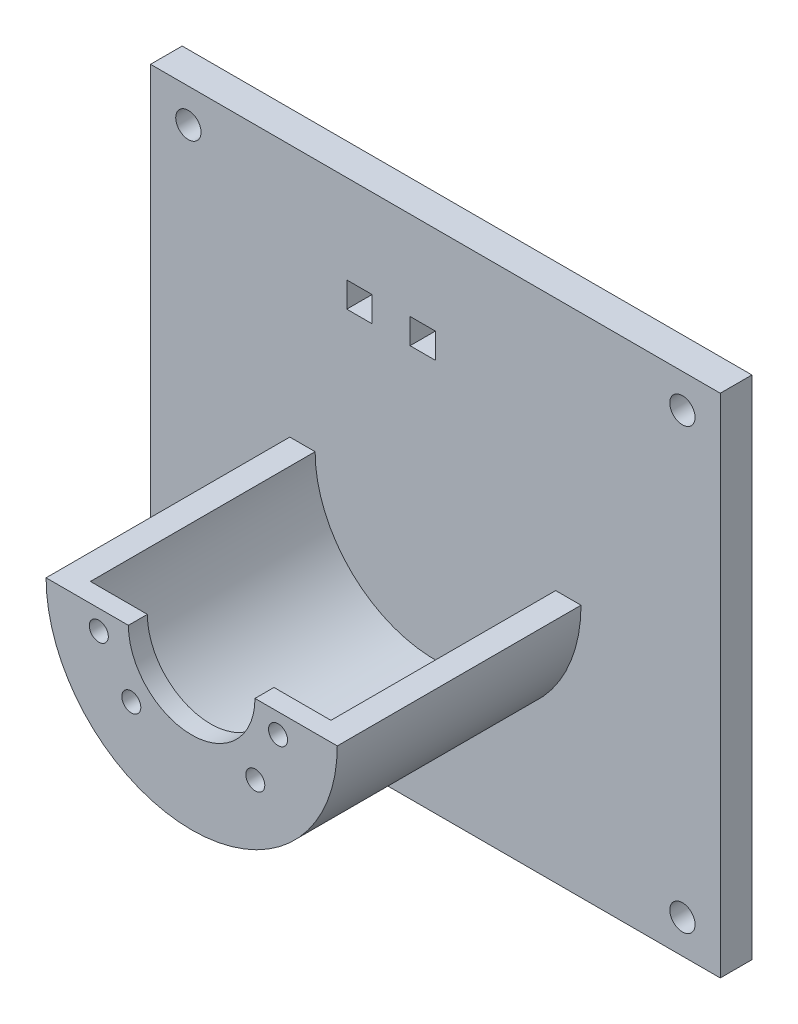
ISO-10303-21;
HEADER;
FILE_DESCRIPTION(('STEP AP214'),'2;1');
FILE_NAME('part.step','',(''),(''),'','','');
FILE_SCHEMA(('AUTOMOTIVE_DESIGN { 1 0 10303 214 1 1 1 1 }'));
ENDSEC;
DATA;
#1=APPLICATION_CONTEXT('core data for automotive mechanical design processes');
#2=APPLICATION_PROTOCOL_DEFINITION('international standard','automotive_design',2000,#1);
#3=PRODUCT_CONTEXT('',#1,'mechanical');
#4=PRODUCT('Part','Part','',(#3));
#5=PRODUCT_RELATED_PRODUCT_CATEGORY('part','',(#4));
#6=PRODUCT_DEFINITION_FORMATION('','',#4);
#7=PRODUCT_DEFINITION_CONTEXT('part definition',#1,'design');
#8=PRODUCT_DEFINITION('design','',#6,#7);
#9=PRODUCT_DEFINITION_SHAPE('','',#8);
#10=(LENGTH_UNIT() NAMED_UNIT(*) SI_UNIT(.MILLI.,.METRE.));
#11=(NAMED_UNIT(*) PLANE_ANGLE_UNIT() SI_UNIT($,.RADIAN.));
#12=(NAMED_UNIT(*) SI_UNIT($,.STERADIAN.) SOLID_ANGLE_UNIT());
#13=UNCERTAINTY_MEASURE_WITH_UNIT(LENGTH_MEASURE(1.E-05),#10,'distance_accuracy_value','');
#14=(GEOMETRIC_REPRESENTATION_CONTEXT(3) GLOBAL_UNCERTAINTY_ASSIGNED_CONTEXT((#13)) GLOBAL_UNIT_ASSIGNED_CONTEXT((#10,
#11,#12)) REPRESENTATION_CONTEXT('',''));
#15=CARTESIAN_POINT('',(0.,0.,0.));
#16=DIRECTION('',(0.,0.,1.));
#17=DIRECTION('',(1.,0.,0.));
#18=AXIS2_PLACEMENT_3D('',#15,#16,#17);
#19=CARTESIAN_POINT('',(-23.,0.,35.5));
#20=DIRECTION('',(0.,1.,0.));
#21=DIRECTION('',(0.,0.,1.));
#22=AXIS2_PLACEMENT_3D('',#19,#20,#21);
#23=PLANE('',#22);
#24=DIRECTION('',(1.,0.,0.));
#25=VECTOR('',#24,1.);
#26=CARTESIAN_POINT('',(-23.,0.,0.));
#27=LINE('',#26,#25);
#28=CARTESIAN_POINT('',(-23.,0.,0.));
#29=VERTEX_POINT('',#28);
#30=CARTESIAN_POINT('',(-19.,0.,0.));
#31=VERTEX_POINT('',#30);
#32=EDGE_CURVE('E404',#29,#31,#27,.T.);
#33=ORIENTED_EDGE('',*,*,#32,.F.);
#34=DIRECTION('',(0.,0.,-1.));
#35=VECTOR('',#34,1.);
#36=CARTESIAN_POINT('',(-23.,0.,35.5));
#37=LINE('',#36,#35);
#38=CARTESIAN_POINT('',(-23.,-1.60608141586784E-13,38.5));
#39=VERTEX_POINT('',#38);
#40=EDGE_CURVE('E11',#39,#29,#37,.T.);
#41=ORIENTED_EDGE('',*,*,#40,.F.);
#42=DIRECTION('',(-1.,0.,0.));
#43=VECTOR('',#42,1.);
#44=CARTESIAN_POINT('',(-23.,-1.60608141586784E-13,38.5));
#45=LINE('',#44,#43);
#46=CARTESIAN_POINT('',(-10.,0.,38.5));
#47=VERTEX_POINT('',#46);
#48=EDGE_CURVE('E299',#47,#39,#45,.T.);
#49=ORIENTED_EDGE('',*,*,#48,.F.);
#50=DIRECTION('',(0.,0.,-1.));
#51=VECTOR('',#50,1.);
#52=CARTESIAN_POINT('',(-10.,0.,38.5));
#53=LINE('',#52,#51);
#54=CARTESIAN_POINT('',(-10.,0.,35.5));
#55=VERTEX_POINT('',#54);
#56=EDGE_CURVE('E324',#47,#55,#53,.T.);
#57=ORIENTED_EDGE('',*,*,#56,.T.);
#58=DIRECTION('',(-1.,0.,0.));
#59=VECTOR('',#58,1.);
#60=CARTESIAN_POINT('',(-23.,-1.60608141586784E-13,35.5));
#61=LINE('',#60,#59);
#62=CARTESIAN_POINT('',(-19.,-1.11190251867774E-13,35.5));
#63=VERTEX_POINT('',#62);
#64=EDGE_CURVE('E315',#55,#63,#61,.T.);
#65=ORIENTED_EDGE('',*,*,#64,.T.);
#66=DIRECTION('',(0.,0.,-1.));
#67=VECTOR('',#66,1.);
#68=CARTESIAN_POINT('',(-19.,0.,35.5));
#69=LINE('',#68,#67);
#70=EDGE_CURVE('E45',#63,#31,#69,.T.);
#71=ORIENTED_EDGE('',*,*,#70,.T.);
#72=EDGE_LOOP('',(#33,#41,#49,#57,#65,#71));
#73=FACE_BOUND('',#72,.T.);
#74=ADVANCED_FACE('F42',(#73),#23,.T.);
#75=CARTESIAN_POINT('',(0.,0.,35.5));
#76=DIRECTION('',(0.,0.,-1.));
#77=DIRECTION('',(-1.,0.,0.));
#78=AXIS2_PLACEMENT_3D('',#75,#76,#77);
#79=CYLINDRICAL_SURFACE('',#78,23.);
#80=CARTESIAN_POINT('',(0.,0.,0.));
#81=DIRECTION('',(0.,0.,1.));
#82=DIRECTION('',(1.,0.,0.));
#83=AXIS2_PLACEMENT_3D('',#80,#81,#82);
#84=CIRCLE('',#83,23.);
#85=CARTESIAN_POINT('',(23.,0.,0.));
#86=VERTEX_POINT('',#85);
#87=EDGE_CURVE('E409',#29,#86,#84,.T.);
#88=ORIENTED_EDGE('',*,*,#87,.T.);
#89=DIRECTION('',(0.,0.,-1.));
#90=VECTOR('',#89,1.);
#91=CARTESIAN_POINT('',(23.,0.,35.5));
#92=LINE('',#91,#90);
#93=CARTESIAN_POINT('',(23.,0.,38.5));
#94=VERTEX_POINT('',#93);
#95=EDGE_CURVE('E51',#94,#86,#92,.T.);
#96=ORIENTED_EDGE('',*,*,#95,.F.);
#97=CARTESIAN_POINT('',(0.,0.,38.5));
#98=DIRECTION('',(0.,0.,1.));
#99=DIRECTION('',(1.,0.,0.));
#100=AXIS2_PLACEMENT_3D('',#97,#98,#99);
#101=CIRCLE('',#100,23.);
#102=EDGE_CURVE('E304',#39,#94,#101,.T.);
#103=ORIENTED_EDGE('',*,*,#102,.F.);
#104=ORIENTED_EDGE('',*,*,#40,.T.);
#105=EDGE_LOOP('',(#88,#96,#103,#104));
#106=FACE_BOUND('',#105,.T.);
#107=ADVANCED_FACE('F440',(#106),#79,.T.);
#108=CARTESIAN_POINT('',(19.,0.,35.5));
#109=DIRECTION('',(0.,1.,0.));
#110=DIRECTION('',(0.,0.,1.));
#111=AXIS2_PLACEMENT_3D('',#108,#109,#110);
#112=PLANE('',#111);
#113=DIRECTION('',(1.,0.,0.));
#114=VECTOR('',#113,1.);
#115=CARTESIAN_POINT('',(19.,0.,0.));
#116=LINE('',#115,#114);
#117=CARTESIAN_POINT('',(19.,0.,0.));
#118=VERTEX_POINT('',#117);
#119=EDGE_CURVE('E415',#118,#86,#116,.T.);
#120=ORIENTED_EDGE('',*,*,#119,.F.);
#121=DIRECTION('',(0.,0.,-1.));
#122=VECTOR('',#121,1.);
#123=CARTESIAN_POINT('',(19.,0.,35.5));
#124=LINE('',#123,#122);
#125=CARTESIAN_POINT('',(19.,0.,35.5));
#126=VERTEX_POINT('',#125);
#127=EDGE_CURVE('E423',#126,#118,#124,.T.);
#128=ORIENTED_EDGE('',*,*,#127,.F.);
#129=DIRECTION('',(-1.,0.,0.));
#130=VECTOR('',#129,1.);
#131=CARTESIAN_POINT('',(10.,0.,35.5));
#132=LINE('',#131,#130);
#133=CARTESIAN_POINT('',(10.,0.,35.5));
#134=VERTEX_POINT('',#133);
#135=EDGE_CURVE('E300',#126,#134,#132,.T.);
#136=ORIENTED_EDGE('',*,*,#135,.T.);
#137=DIRECTION('',(0.,0.,-1.));
#138=VECTOR('',#137,1.);
#139=CARTESIAN_POINT('',(10.,0.,38.5));
#140=LINE('',#139,#138);
#141=CARTESIAN_POINT('',(10.,0.,38.5));
#142=VERTEX_POINT('',#141);
#143=EDGE_CURVE('E311',#142,#134,#140,.T.);
#144=ORIENTED_EDGE('',*,*,#143,.F.);
#145=DIRECTION('',(-1.,0.,0.));
#146=VECTOR('',#145,1.);
#147=CARTESIAN_POINT('',(10.,0.,38.5));
#148=LINE('',#147,#146);
#149=EDGE_CURVE('E308',#94,#142,#148,.T.);
#150=ORIENTED_EDGE('',*,*,#149,.F.);
#151=ORIENTED_EDGE('',*,*,#95,.T.);
#152=EDGE_LOOP('',(#120,#128,#136,#144,#150,#151));
#153=FACE_BOUND('',#152,.T.);
#154=ADVANCED_FACE('F453',(#153),#112,.T.);
#155=CARTESIAN_POINT('',(0.,0.,35.5));
#156=DIRECTION('',(0.,0.,-1.));
#157=DIRECTION('',(-1.,0.,0.));
#158=AXIS2_PLACEMENT_3D('',#155,#156,#157);
#159=CYLINDRICAL_SURFACE('',#158,19.);
#160=CARTESIAN_POINT('',(0.,0.,0.));
#161=DIRECTION('',(0.,0.,1.));
#162=DIRECTION('',(1.,0.,0.));
#163=AXIS2_PLACEMENT_3D('',#160,#161,#162);
#164=CIRCLE('',#163,19.);
#165=EDGE_CURVE('E412',#31,#118,#164,.T.);
#166=ORIENTED_EDGE('',*,*,#165,.F.);
#167=ORIENTED_EDGE('',*,*,#70,.F.);
#168=CARTESIAN_POINT('',(0.,0.,35.5));
#169=DIRECTION('',(0.,0.,1.));
#170=DIRECTION('',(1.,0.,0.));
#171=AXIS2_PLACEMENT_3D('',#168,#169,#170);
#172=CIRCLE('',#171,19.);
#173=EDGE_CURVE('E405',#63,#126,#172,.T.);
#174=ORIENTED_EDGE('',*,*,#173,.T.);
#175=ORIENTED_EDGE('',*,*,#127,.T.);
#176=EDGE_LOOP('',(#166,#167,#174,#175));
#177=FACE_BOUND('',#176,.T.);
#178=ADVANCED_FACE('F435',(#177),#159,.F.);
#179=CARTESIAN_POINT('',(0.,0.,0.));
#180=DIRECTION('',(0.,0.,-1.));
#181=DIRECTION('',(-1.,0.,0.));
#182=AXIS2_PLACEMENT_3D('',#179,#180,#181);
#183=PLANE('',#182);
#184=DIRECTION('',(1.,0.,0.));
#185=VECTOR('',#184,1.);
#186=CARTESIAN_POINT('',(-14.,22.,0.));
#187=LINE('',#186,#185);
#188=CARTESIAN_POINT('',(-14.,22.,0.));
#189=VERTEX_POINT('',#188);
#190=CARTESIAN_POINT('',(-10.,22.,0.));
#191=VERTEX_POINT('',#190);
#192=EDGE_CURVE('E206',#189,#191,#187,.T.);
#193=ORIENTED_EDGE('',*,*,#192,.F.);
#194=DIRECTION('',(0.,-1.,0.));
#195=VECTOR('',#194,1.);
#196=CARTESIAN_POINT('',(-14.,26.,0.));
#197=LINE('',#196,#195);
#198=CARTESIAN_POINT('',(-14.,26.,0.));
#199=VERTEX_POINT('',#198);
#200=EDGE_CURVE('E59',#199,#189,#197,.T.);
#201=ORIENTED_EDGE('',*,*,#200,.F.);
#202=DIRECTION('',(-1.,0.,0.));
#203=VECTOR('',#202,1.);
#204=CARTESIAN_POINT('',(-14.,26.,0.));
#205=LINE('',#204,#203);
#206=CARTESIAN_POINT('',(-10.,26.,0.));
#207=VERTEX_POINT('',#206);
#208=EDGE_CURVE('E193',#207,#199,#205,.T.);
#209=ORIENTED_EDGE('',*,*,#208,.F.);
#210=DIRECTION('',(0.,1.,0.));
#211=VECTOR('',#210,1.);
#212=CARTESIAN_POINT('',(-10.,26.,0.));
#213=LINE('',#212,#211);
#214=EDGE_CURVE('E197',#191,#207,#213,.T.);
#215=ORIENTED_EDGE('',*,*,#214,.F.);
#216=EDGE_LOOP('',(#193,#201,#209,#215));
#217=FACE_BOUND('',#216,.T.);
#218=DIRECTION('',(0.,-1.,0.));
#219=VECTOR('',#218,1.);
#220=CARTESIAN_POINT('',(-4.,26.0000000000001,0.));
#221=LINE('',#220,#219);
#222=CARTESIAN_POINT('',(-4.,26.0000000000001,0.));
#223=VERTEX_POINT('',#222);
#224=CARTESIAN_POINT('',(-4.,22.0000000000001,0.));
#225=VERTEX_POINT('',#224);
#226=EDGE_CURVE('E242',#223,#225,#221,.T.);
#227=ORIENTED_EDGE('',*,*,#226,.F.);
#228=DIRECTION('',(-1.,0.,0.));
#229=VECTOR('',#228,1.);
#230=CARTESIAN_POINT('',(-4.,26.0000000000001,0.));
#231=LINE('',#230,#229);
#232=CARTESIAN_POINT('',(0.,26.0000000000001,0.));
#233=VERTEX_POINT('',#232);
#234=EDGE_CURVE('E67',#233,#223,#231,.T.);
#235=ORIENTED_EDGE('',*,*,#234,.F.);
#236=DIRECTION('',(0.,1.,0.));
#237=VECTOR('',#236,1.);
#238=CARTESIAN_POINT('',(0.,26.0000000000001,0.));
#239=LINE('',#238,#237);
#240=CARTESIAN_POINT('',(0.,22.0000000000001,0.));
#241=VERTEX_POINT('',#240);
#242=EDGE_CURVE('E227',#241,#233,#239,.T.);
#243=ORIENTED_EDGE('',*,*,#242,.F.);
#244=DIRECTION('',(1.,0.,0.));
#245=VECTOR('',#244,1.);
#246=CARTESIAN_POINT('',(-4.,22.0000000000001,0.));
#247=LINE('',#246,#245);
#248=EDGE_CURVE('E246',#225,#241,#247,.T.);
#249=ORIENTED_EDGE('',*,*,#248,.F.);
#250=EDGE_LOOP('',(#227,#235,#243,#249));
#251=FACE_BOUND('',#250,.T.);
#252=CARTESIAN_POINT('',(-39.0207254505307,34.6850892893606,0.));
#253=DIRECTION('',(0.,0.,-1.));
#254=DIRECTION('',(-1.,0.,0.));
#255=AXIS2_PLACEMENT_3D('',#252,#253,#254);
#256=CIRCLE('',#255,2.);
#257=CARTESIAN_POINT('',(-41.0207254505307,34.6850892893606,0.));
#258=VERTEX_POINT('',#257);
#259=EDGE_CURVE('E328',#258,#258,#256,.F.);
#260=ORIENTED_EDGE('',*,*,#259,.F.);
#261=EDGE_LOOP('',(#260));
#262=FACE_BOUND('',#261,.T.);
#263=CARTESIAN_POINT('',(39.0207254505307,34.6850892893606,0.));
#264=DIRECTION('',(0.,0.,-1.));
#265=DIRECTION('',(-1.,0.,0.));
#266=AXIS2_PLACEMENT_3D('',#263,#264,#265);
#267=CIRCLE('',#266,2.);
#268=CARTESIAN_POINT('',(37.0207254505307,34.6850892893606,0.));
#269=VERTEX_POINT('',#268);
#270=EDGE_CURVE('E365',#269,#269,#267,.T.);
#271=ORIENTED_EDGE('',*,*,#270,.T.);
#272=EDGE_LOOP('',(#271));
#273=FACE_BOUND('',#272,.T.);
#274=DIRECTION('',(0.,-1.,0.));
#275=VECTOR('',#274,1.);
#276=CARTESIAN_POINT('',(-45.,0.,0.));
#277=LINE('',#276,#275);
#278=CARTESIAN_POINT('',(-45.,40.,0.));
#279=VERTEX_POINT('',#278);
#280=CARTESIAN_POINT('',(-45.,-40.,0.));
#281=VERTEX_POINT('',#280);
#282=EDGE_CURVE('E369',#279,#281,#277,.T.);
#283=ORIENTED_EDGE('',*,*,#282,.T.);
#284=DIRECTION('',(-1.,0.,0.));
#285=VECTOR('',#284,1.);
#286=CARTESIAN_POINT('',(0.,-40.,0.));
#287=LINE('',#286,#285);
#288=CARTESIAN_POINT('',(45.,-40.,0.));
#289=VERTEX_POINT('',#288);
#290=EDGE_CURVE('E381',#289,#281,#287,.T.);
#291=ORIENTED_EDGE('',*,*,#290,.F.);
#292=DIRECTION('',(0.,-1.,0.));
#293=VECTOR('',#292,1.);
#294=CARTESIAN_POINT('',(45.,0.,0.));
#295=LINE('',#294,#293);
#296=CARTESIAN_POINT('',(45.,40.,0.));
#297=VERTEX_POINT('',#296);
#298=EDGE_CURVE('E377',#297,#289,#295,.T.);
#299=ORIENTED_EDGE('',*,*,#298,.F.);
#300=DIRECTION('',(-1.,0.,0.));
#301=VECTOR('',#300,1.);
#302=CARTESIAN_POINT('',(0.,40.,0.));
#303=LINE('',#302,#301);
#304=EDGE_CURVE('E373',#297,#279,#303,.T.);
#305=ORIENTED_EDGE('',*,*,#304,.T.);
#306=EDGE_LOOP('',(#283,#291,#299,#305));
#307=FACE_BOUND('',#306,.T.);
#308=CARTESIAN_POINT('',(-39.0207254505307,-34.6850892893606,0.));
#309=DIRECTION('',(0.,0.,-1.));
#310=DIRECTION('',(-1.,0.,0.));
#311=AXIS2_PLACEMENT_3D('',#308,#309,#310);
#312=CIRCLE('',#311,2.);
#313=CARTESIAN_POINT('',(-41.0207254505307,-34.6850892893606,0.));
#314=VERTEX_POINT('',#313);
#315=EDGE_CURVE('E385',#314,#314,#312,.T.);
#316=ORIENTED_EDGE('',*,*,#315,.T.);
#317=EDGE_LOOP('',(#316));
#318=FACE_BOUND('',#317,.T.);
#319=CARTESIAN_POINT('',(39.0207254505307,-34.6850892893606,0.));
#320=DIRECTION('',(0.,0.,-1.));
#321=DIRECTION('',(-1.,0.,0.));
#322=AXIS2_PLACEMENT_3D('',#319,#320,#321);
#323=CIRCLE('',#322,2.);
#324=CARTESIAN_POINT('',(37.0207254505307,-34.6850892893606,0.));
#325=VERTEX_POINT('',#324);
#326=EDGE_CURVE('E334',#325,#325,#323,.F.);
#327=ORIENTED_EDGE('',*,*,#326,.F.);
#328=EDGE_LOOP('',(#327));
#329=FACE_BOUND('',#328,.T.);
#330=ORIENTED_EDGE('',*,*,#87,.F.);
#331=ORIENTED_EDGE('',*,*,#32,.T.);
#332=ORIENTED_EDGE('',*,*,#165,.T.);
#333=ORIENTED_EDGE('',*,*,#119,.T.);
#334=EDGE_LOOP('',(#330,#331,#332,#333));
#335=FACE_BOUND('',#334,.T.);
#336=ADVANCED_FACE('F437',(#217,#251,#262,#273,#307,#318,#329,#335),#183,.F.);
#337=CARTESIAN_POINT('',(-45.,0.,-5.));
#338=DIRECTION('',(-1.,0.,0.));
#339=DIRECTION('',(0.,-1.,0.));
#340=AXIS2_PLACEMENT_3D('',#337,#338,#339);
#341=PLANE('',#340);
#342=ORIENTED_EDGE('',*,*,#282,.F.);
#343=DIRECTION('',(0.,0.,1.));
#344=VECTOR('',#343,1.);
#345=CARTESIAN_POINT('',(-45.,40.,-5.));
#346=LINE('',#345,#344);
#347=CARTESIAN_POINT('',(-45.,40.,-5.));
#348=VERTEX_POINT('',#347);
#349=EDGE_CURVE('E401',#348,#279,#346,.T.);
#350=ORIENTED_EDGE('',*,*,#349,.F.);
#351=DIRECTION('',(0.,-1.,0.));
#352=VECTOR('',#351,1.);
#353=CARTESIAN_POINT('',(-45.,0.,-5.));
#354=LINE('',#353,#352);
#355=CARTESIAN_POINT('',(-45.,-40.,-5.));
#356=VERTEX_POINT('',#355);
#357=EDGE_CURVE('E338',#348,#356,#354,.T.);
#358=ORIENTED_EDGE('',*,*,#357,.T.);
#359=DIRECTION('',(0.,0.,1.));
#360=VECTOR('',#359,1.);
#361=CARTESIAN_POINT('',(-45.,-40.,-5.));
#362=LINE('',#361,#360);
#363=EDGE_CURVE('E361',#356,#281,#362,.T.);
#364=ORIENTED_EDGE('',*,*,#363,.T.);
#365=EDGE_LOOP('',(#342,#350,#358,#364));
#366=FACE_BOUND('',#365,.T.);
#367=ADVANCED_FACE('F560',(#366),#341,.T.);
#368=CARTESIAN_POINT('',(0.,40.,-5.));
#369=DIRECTION('',(0.,1.,0.));
#370=DIRECTION('',(0.,0.,1.));
#371=AXIS2_PLACEMENT_3D('',#368,#369,#370);
#372=PLANE('',#371);
#373=ORIENTED_EDGE('',*,*,#304,.F.);
#374=DIRECTION('',(0.,0.,1.));
#375=VECTOR('',#374,1.);
#376=CARTESIAN_POINT('',(45.,40.,-5.));
#377=LINE('',#376,#375);
#378=CARTESIAN_POINT('',(45.,40.,-5.));
#379=VERTEX_POINT('',#378);
#380=EDGE_CURVE('E398',#379,#297,#377,.T.);
#381=ORIENTED_EDGE('',*,*,#380,.F.);
#382=DIRECTION('',(-1.,0.,0.));
#383=VECTOR('',#382,1.);
#384=CARTESIAN_POINT('',(0.,40.,-5.));
#385=LINE('',#384,#383);
#386=EDGE_CURVE('E342',#379,#348,#385,.T.);
#387=ORIENTED_EDGE('',*,*,#386,.T.);
#388=ORIENTED_EDGE('',*,*,#349,.T.);
#389=EDGE_LOOP('',(#373,#381,#387,#388));
#390=FACE_BOUND('',#389,.T.);
#391=ADVANCED_FACE('F659',(#390),#372,.T.);
#392=CARTESIAN_POINT('',(45.,0.,-5.));
#393=DIRECTION('',(-1.,0.,0.));
#394=DIRECTION('',(0.,-1.,0.));
#395=AXIS2_PLACEMENT_3D('',#392,#393,#394);
#396=PLANE('',#395);
#397=ORIENTED_EDGE('',*,*,#298,.T.);
#398=DIRECTION('',(0.,0.,1.));
#399=VECTOR('',#398,1.);
#400=CARTESIAN_POINT('',(45.,-40.,-5.));
#401=LINE('',#400,#399);
#402=CARTESIAN_POINT('',(45.,-40.,-5.));
#403=VERTEX_POINT('',#402);
#404=EDGE_CURVE('E394',#403,#289,#401,.T.);
#405=ORIENTED_EDGE('',*,*,#404,.F.);
#406=DIRECTION('',(0.,-1.,0.));
#407=VECTOR('',#406,1.);
#408=CARTESIAN_POINT('',(45.,0.,-5.));
#409=LINE('',#408,#407);
#410=EDGE_CURVE('E346',#379,#403,#409,.T.);
#411=ORIENTED_EDGE('',*,*,#410,.F.);
#412=ORIENTED_EDGE('',*,*,#380,.T.);
#413=EDGE_LOOP('',(#397,#405,#411,#412));
#414=FACE_BOUND('',#413,.T.);
#415=ADVANCED_FACE('F651',(#414),#396,.F.);
#416=CARTESIAN_POINT('',(-39.0207254505307,-34.6850892893606,-5.));
#417=DIRECTION('',(0.,0.,1.));
#418=DIRECTION('',(1.,0.,0.));
#419=AXIS2_PLACEMENT_3D('',#416,#417,#418);
#420=CYLINDRICAL_SURFACE('',#419,2.);
#421=CARTESIAN_POINT('',(-39.0207254505307,-34.6850892893606,-5.));
#422=DIRECTION('',(0.,0.,-1.));
#423=DIRECTION('',(-1.,0.,0.));
#424=AXIS2_PLACEMENT_3D('',#421,#422,#423);
#425=CIRCLE('',#424,2.);
#426=CARTESIAN_POINT('',(-41.0207254505307,-34.6850892893606,-5.));
#427=VERTEX_POINT('',#426);
#428=EDGE_CURVE('E353',#427,#427,#425,.T.);
#429=ORIENTED_EDGE('',*,*,#428,.T.);
#430=EDGE_LOOP('',(#429));
#431=FACE_BOUND('',#430,.T.);
#432=ORIENTED_EDGE('',*,*,#315,.F.);
#433=EDGE_LOOP('',(#432));
#434=FACE_BOUND('',#433,.T.);
#435=ADVANCED_FACE('F647',(#431,#434),#420,.F.);
#436=CARTESIAN_POINT('',(0.,-40.,-5.));
#437=DIRECTION('',(0.,1.,0.));
#438=DIRECTION('',(0.,0.,1.));
#439=AXIS2_PLACEMENT_3D('',#436,#437,#438);
#440=PLANE('',#439);
#441=ORIENTED_EDGE('',*,*,#290,.T.);
#442=ORIENTED_EDGE('',*,*,#363,.F.);
#443=DIRECTION('',(-1.,0.,0.));
#444=VECTOR('',#443,1.);
#445=CARTESIAN_POINT('',(0.,-40.,-5.));
#446=LINE('',#445,#444);
#447=EDGE_CURVE('E350',#403,#356,#446,.T.);
#448=ORIENTED_EDGE('',*,*,#447,.F.);
#449=ORIENTED_EDGE('',*,*,#404,.T.);
#450=EDGE_LOOP('',(#441,#442,#448,#449));
#451=FACE_BOUND('',#450,.T.);
#452=ADVANCED_FACE('F650',(#451),#440,.F.);
#453=CARTESIAN_POINT('',(39.0207254505307,34.6850892893606,-5.));
#454=DIRECTION('',(0.,0.,1.));
#455=DIRECTION('',(1.,0.,0.));
#456=AXIS2_PLACEMENT_3D('',#453,#454,#455);
#457=CYLINDRICAL_SURFACE('',#456,2.);
#458=CARTESIAN_POINT('',(39.0207254505307,34.6850892893606,-5.));
#459=DIRECTION('',(0.,0.,-1.));
#460=DIRECTION('',(-1.,0.,0.));
#461=AXIS2_PLACEMENT_3D('',#458,#459,#460);
#462=CIRCLE('',#461,2.);
#463=CARTESIAN_POINT('',(37.0207254505307,34.6850892893606,-5.));
#464=VERTEX_POINT('',#463);
#465=EDGE_CURVE('E333',#464,#464,#462,.T.);
#466=ORIENTED_EDGE('',*,*,#465,.T.);
#467=EDGE_LOOP('',(#466));
#468=FACE_BOUND('',#467,.T.);
#469=ORIENTED_EDGE('',*,*,#270,.F.);
#470=EDGE_LOOP('',(#469));
#471=FACE_BOUND('',#470,.T.);
#472=ADVANCED_FACE('F655',(#468,#471),#457,.F.);
#473=CARTESIAN_POINT('',(-39.0207254505307,34.6850892893606,-5.));
#474=DIRECTION('',(0.,0.,1.));
#475=DIRECTION('',(1.,0.,0.));
#476=AXIS2_PLACEMENT_3D('',#473,#474,#475);
#477=CYLINDRICAL_SURFACE('',#476,2.);
#478=CARTESIAN_POINT('',(-39.0207254505307,34.6850892893606,-5.));
#479=DIRECTION('',(0.,0.,-1.));
#480=DIRECTION('',(-1.,0.,0.));
#481=AXIS2_PLACEMENT_3D('',#478,#479,#480);
#482=CIRCLE('',#481,2.);
#483=CARTESIAN_POINT('',(-41.0207254505307,34.6850892893606,-5.));
#484=VERTEX_POINT('',#483);
#485=EDGE_CURVE('E329',#484,#484,#482,.F.);
#486=ORIENTED_EDGE('',*,*,#485,.F.);
#487=EDGE_LOOP('',(#486));
#488=FACE_BOUND('',#487,.T.);
#489=ORIENTED_EDGE('',*,*,#259,.T.);
#490=EDGE_LOOP('',(#489));
#491=FACE_BOUND('',#490,.T.);
#492=ADVANCED_FACE('F645',(#488,#491),#477,.F.);
#493=CARTESIAN_POINT('',(39.0207254505307,-34.6850892893606,-5.));
#494=DIRECTION('',(0.,0.,1.));
#495=DIRECTION('',(1.,0.,0.));
#496=AXIS2_PLACEMENT_3D('',#493,#494,#495);
#497=CYLINDRICAL_SURFACE('',#496,2.);
#498=CARTESIAN_POINT('',(39.0207254505307,-34.6850892893606,-5.));
#499=DIRECTION('',(0.,0.,-1.));
#500=DIRECTION('',(-1.,0.,0.));
#501=AXIS2_PLACEMENT_3D('',#498,#499,#500);
#502=CIRCLE('',#501,2.);
#503=CARTESIAN_POINT('',(37.0207254505307,-34.6850892893606,-5.));
#504=VERTEX_POINT('',#503);
#505=EDGE_CURVE('E357',#504,#504,#502,.F.);
#506=ORIENTED_EDGE('',*,*,#505,.F.);
#507=EDGE_LOOP('',(#506));
#508=FACE_BOUND('',#507,.T.);
#509=ORIENTED_EDGE('',*,*,#326,.T.);
#510=EDGE_LOOP('',(#509));
#511=FACE_BOUND('',#510,.T.);
#512=ADVANCED_FACE('F567',(#508,#511),#497,.F.);
#513=CARTESIAN_POINT('',(0.,0.,-5.));
#514=DIRECTION('',(0.,0.,-1.));
#515=DIRECTION('',(-1.,0.,0.));
#516=AXIS2_PLACEMENT_3D('',#513,#514,#515);
#517=PLANE('',#516);
#518=DIRECTION('',(0.,-1.,0.));
#519=VECTOR('',#518,1.);
#520=CARTESIAN_POINT('',(-14.,26.,-5.));
#521=LINE('',#520,#519);
#522=CARTESIAN_POINT('',(-14.,26.,-5.));
#523=VERTEX_POINT('',#522);
#524=CARTESIAN_POINT('',(-14.,22.,-5.));
#525=VERTEX_POINT('',#524);
#526=EDGE_CURVE('E171',#523,#525,#521,.T.);
#527=ORIENTED_EDGE('',*,*,#526,.T.);
#528=DIRECTION('',(1.,0.,0.));
#529=VECTOR('',#528,1.);
#530=CARTESIAN_POINT('',(-14.,22.,-5.));
#531=LINE('',#530,#529);
#532=CARTESIAN_POINT('',(-10.,22.,-5.));
#533=VERTEX_POINT('',#532);
#534=EDGE_CURVE('E182',#525,#533,#531,.T.);
#535=ORIENTED_EDGE('',*,*,#534,.T.);
#536=DIRECTION('',(0.,1.,0.));
#537=VECTOR('',#536,1.);
#538=CARTESIAN_POINT('',(-10.,26.,-5.));
#539=LINE('',#538,#537);
#540=CARTESIAN_POINT('',(-10.,26.,-5.));
#541=VERTEX_POINT('',#540);
#542=EDGE_CURVE('E187',#533,#541,#539,.T.);
#543=ORIENTED_EDGE('',*,*,#542,.T.);
#544=DIRECTION('',(-1.,0.,0.));
#545=VECTOR('',#544,1.);
#546=CARTESIAN_POINT('',(-14.,26.,-5.));
#547=LINE('',#546,#545);
#548=EDGE_CURVE('E178',#541,#523,#547,.T.);
#549=ORIENTED_EDGE('',*,*,#548,.T.);
#550=EDGE_LOOP('',(#527,#535,#543,#549));
#551=FACE_BOUND('',#550,.T.);
#552=DIRECTION('',(-1.,0.,0.));
#553=VECTOR('',#552,1.);
#554=CARTESIAN_POINT('',(-4.,26.0000000000001,-5.));
#555=LINE('',#554,#553);
#556=CARTESIAN_POINT('',(0.,26.0000000000001,-5.));
#557=VERTEX_POINT('',#556);
#558=CARTESIAN_POINT('',(-4.,26.0000000000001,-5.));
#559=VERTEX_POINT('',#558);
#560=EDGE_CURVE('E222',#557,#559,#555,.T.);
#561=ORIENTED_EDGE('',*,*,#560,.T.);
#562=DIRECTION('',(0.,-1.,0.));
#563=VECTOR('',#562,1.);
#564=CARTESIAN_POINT('',(-4.,26.0000000000001,-5.));
#565=LINE('',#564,#563);
#566=CARTESIAN_POINT('',(-4.,22.0000000000001,-5.));
#567=VERTEX_POINT('',#566);
#568=EDGE_CURVE('E226',#559,#567,#565,.T.);
#569=ORIENTED_EDGE('',*,*,#568,.T.);
#570=DIRECTION('',(1.,0.,0.));
#571=VECTOR('',#570,1.);
#572=CARTESIAN_POINT('',(-4.,22.0000000000001,-5.));
#573=LINE('',#572,#571);
#574=CARTESIAN_POINT('',(0.,22.0000000000001,-5.));
#575=VERTEX_POINT('',#574);
#576=EDGE_CURVE('E231',#567,#575,#573,.T.);
#577=ORIENTED_EDGE('',*,*,#576,.T.);
#578=DIRECTION('',(0.,1.,0.));
#579=VECTOR('',#578,1.);
#580=CARTESIAN_POINT('',(0.,26.0000000000001,-5.));
#581=LINE('',#580,#579);
#582=EDGE_CURVE('E235',#575,#557,#581,.T.);
#583=ORIENTED_EDGE('',*,*,#582,.T.);
#584=EDGE_LOOP('',(#561,#569,#577,#583));
#585=FACE_BOUND('',#584,.T.);
#586=ORIENTED_EDGE('',*,*,#485,.T.);
#587=EDGE_LOOP('',(#586));
#588=FACE_BOUND('',#587,.T.);
#589=ORIENTED_EDGE('',*,*,#465,.F.);
#590=EDGE_LOOP('',(#589));
#591=FACE_BOUND('',#590,.T.);
#592=ORIENTED_EDGE('',*,*,#357,.F.);
#593=ORIENTED_EDGE('',*,*,#386,.F.);
#594=ORIENTED_EDGE('',*,*,#410,.T.);
#595=ORIENTED_EDGE('',*,*,#447,.T.);
#596=EDGE_LOOP('',(#592,#593,#594,#595));
#597=FACE_BOUND('',#596,.T.);
#598=ORIENTED_EDGE('',*,*,#428,.F.);
#599=EDGE_LOOP('',(#598));
#600=FACE_BOUND('',#599,.T.);
#601=ORIENTED_EDGE('',*,*,#505,.T.);
#602=EDGE_LOOP('',(#601));
#603=FACE_BOUND('',#602,.T.);
#604=ADVANCED_FACE('F189',(#551,#585,#588,#591,#597,#600,#603),#517,.T.);
#605=CARTESIAN_POINT('',(0.,0.,35.5));
#606=DIRECTION('',(0.,0.,1.));
#607=DIRECTION('',(1.,0.,0.));
#608=AXIS2_PLACEMENT_3D('',#605,#606,#607);
#609=PLANE('',#608);
#610=CARTESIAN_POINT('',(-14.668830541062,-3.13455109347509,35.5));
#611=DIRECTION('',(0.,0.,1.));
#612=DIRECTION('',(1.,0.,0.));
#613=AXIS2_PLACEMENT_3D('',#610,#611,#612);
#614=CIRCLE('',#613,1.5);
#615=CARTESIAN_POINT('',(-13.168830541062,-3.13455109347509,35.5));
#616=VERTEX_POINT('',#615);
#617=EDGE_CURVE('E277',#616,#616,#614,.F.);
#618=ORIENTED_EDGE('',*,*,#617,.F.);
#619=EDGE_LOOP('',(#618));
#620=FACE_BOUND('',#619,.T.);
#621=CARTESIAN_POINT('',(13.6445809551776,-3.13455109347509,35.5));
#622=DIRECTION('',(0.,0.,1.));
#623=DIRECTION('',(1.,0.,0.));
#624=AXIS2_PLACEMENT_3D('',#621,#622,#623);
#625=CIRCLE('',#624,1.5);
#626=CARTESIAN_POINT('',(15.1445809551776,-3.13455109347509,35.5));
#627=VERTEX_POINT('',#626);
#628=EDGE_CURVE('E268',#627,#627,#625,.F.);
#629=ORIENTED_EDGE('',*,*,#628,.F.);
#630=EDGE_LOOP('',(#629));
#631=FACE_BOUND('',#630,.T.);
#632=CARTESIAN_POINT('',(10.0490161469407,-11.1363043456312,35.5));
#633=DIRECTION('',(0.,0.,1.));
#634=DIRECTION('',(1.,0.,0.));
#635=AXIS2_PLACEMENT_3D('',#632,#633,#634);
#636=CIRCLE('',#635,1.5);
#637=CARTESIAN_POINT('',(11.5490161469407,-11.1363043456312,35.5));
#638=VERTEX_POINT('',#637);
#639=EDGE_CURVE('E267',#638,#638,#636,.F.);
#640=ORIENTED_EDGE('',*,*,#639,.F.);
#641=EDGE_LOOP('',(#640));
#642=FACE_BOUND('',#641,.T.);
#643=CARTESIAN_POINT('',(-9.5368913539985,-10.2492781844396,35.5));
#644=DIRECTION('',(0.,0.,1.));
#645=DIRECTION('',(1.,0.,0.));
#646=AXIS2_PLACEMENT_3D('',#643,#644,#645);
#647=CIRCLE('',#646,1.5);
#648=CARTESIAN_POINT('',(-8.0368913539985,-10.2492781844396,35.5));
#649=VERTEX_POINT('',#648);
#650=EDGE_CURVE('E290',#649,#649,#647,.F.);
#651=ORIENTED_EDGE('',*,*,#650,.F.);
#652=EDGE_LOOP('',(#651));
#653=FACE_BOUND('',#652,.T.);
#654=ORIENTED_EDGE('',*,*,#173,.F.);
#655=ORIENTED_EDGE('',*,*,#64,.F.);
#656=CARTESIAN_POINT('',(0.,0.,35.5));
#657=DIRECTION('',(0.,0.,-1.));
#658=DIRECTION('',(1.,0.,0.));
#659=AXIS2_PLACEMENT_3D('',#656,#657,#658);
#660=CIRCLE('',#659,10.);
#661=EDGE_CURVE('E294',#134,#55,#660,.T.);
#662=ORIENTED_EDGE('',*,*,#661,.F.);
#663=ORIENTED_EDGE('',*,*,#135,.F.);
#664=EDGE_LOOP('',(#654,#655,#662,#663));
#665=FACE_BOUND('',#664,.T.);
#666=ADVANCED_FACE('F451',(#620,#631,#642,#653,#665),#609,.F.);
#667=CARTESIAN_POINT('',(0.,0.,38.5));
#668=DIRECTION('',(0.,0.,-1.));
#669=DIRECTION('',(-1.,0.,0.));
#670=AXIS2_PLACEMENT_3D('',#667,#668,#669);
#671=CYLINDRICAL_SURFACE('',#670,10.);
#672=ORIENTED_EDGE('',*,*,#661,.T.);
#673=ORIENTED_EDGE('',*,*,#56,.F.);
#674=CARTESIAN_POINT('',(0.,0.,38.5));
#675=DIRECTION('',(0.,0.,-1.));
#676=DIRECTION('',(1.,0.,0.));
#677=AXIS2_PLACEMENT_3D('',#674,#675,#676);
#678=CIRCLE('',#677,10.);
#679=EDGE_CURVE('E295',#142,#47,#678,.T.);
#680=ORIENTED_EDGE('',*,*,#679,.F.);
#681=ORIENTED_EDGE('',*,*,#143,.T.);
#682=EDGE_LOOP('',(#672,#673,#680,#681));
#683=FACE_BOUND('',#682,.T.);
#684=ADVANCED_FACE('F448',(#683),#671,.F.);
#685=CARTESIAN_POINT('',(0.,0.,38.5));
#686=DIRECTION('',(0.,0.,1.));
#687=DIRECTION('',(1.,0.,0.));
#688=AXIS2_PLACEMENT_3D('',#685,#686,#687);
#689=PLANE('',#688);
#690=CARTESIAN_POINT('',(-14.668830541062,-3.13455109347509,38.5));
#691=DIRECTION('',(0.,0.,1.));
#692=DIRECTION('',(1.,0.,0.));
#693=AXIS2_PLACEMENT_3D('',#690,#691,#692);
#694=CIRCLE('',#693,1.5);
#695=CARTESIAN_POINT('',(-13.168830541062,-3.13455109347509,38.5));
#696=VERTEX_POINT('',#695);
#697=EDGE_CURVE('E216',#696,#696,#694,.T.);
#698=ORIENTED_EDGE('',*,*,#697,.F.);
#699=EDGE_LOOP('',(#698));
#700=FACE_BOUND('',#699,.T.);
#701=CARTESIAN_POINT('',(13.6445809551776,-3.13455109347509,38.5));
#702=DIRECTION('',(0.,0.,1.));
#703=DIRECTION('',(1.,0.,0.));
#704=AXIS2_PLACEMENT_3D('',#701,#702,#703);
#705=CIRCLE('',#704,1.5);
#706=CARTESIAN_POINT('',(15.1445809551776,-3.13455109347509,38.5));
#707=VERTEX_POINT('',#706);
#708=EDGE_CURVE('E273',#707,#707,#705,.T.);
#709=ORIENTED_EDGE('',*,*,#708,.F.);
#710=EDGE_LOOP('',(#709));
#711=FACE_BOUND('',#710,.T.);
#712=CARTESIAN_POINT('',(10.0490161469407,-11.1363043456312,38.5));
#713=DIRECTION('',(0.,0.,1.));
#714=DIRECTION('',(1.,0.,0.));
#715=AXIS2_PLACEMENT_3D('',#712,#713,#714);
#716=CIRCLE('',#715,1.5);
#717=CARTESIAN_POINT('',(11.5490161469407,-11.1363043456312,38.5));
#718=VERTEX_POINT('',#717);
#719=EDGE_CURVE('E263',#718,#718,#716,.T.);
#720=ORIENTED_EDGE('',*,*,#719,.F.);
#721=EDGE_LOOP('',(#720));
#722=FACE_BOUND('',#721,.T.);
#723=CARTESIAN_POINT('',(-9.5368913539985,-10.2492781844396,38.5));
#724=DIRECTION('',(0.,0.,1.));
#725=DIRECTION('',(1.,0.,0.));
#726=AXIS2_PLACEMENT_3D('',#723,#724,#725);
#727=CIRCLE('',#726,1.5);
#728=CARTESIAN_POINT('',(-8.0368913539985,-10.2492781844396,38.5));
#729=VERTEX_POINT('',#728);
#730=EDGE_CURVE('E272',#729,#729,#727,.T.);
#731=ORIENTED_EDGE('',*,*,#730,.F.);
#732=EDGE_LOOP('',(#731));
#733=FACE_BOUND('',#732,.T.);
#734=ORIENTED_EDGE('',*,*,#679,.T.);
#735=ORIENTED_EDGE('',*,*,#48,.T.);
#736=ORIENTED_EDGE('',*,*,#102,.T.);
#737=ORIENTED_EDGE('',*,*,#149,.T.);
#738=EDGE_LOOP('',(#734,#735,#736,#737));
#739=FACE_BOUND('',#738,.T.);
#740=ADVANCED_FACE('F442',(#700,#711,#722,#733,#739),#689,.T.);
#741=CARTESIAN_POINT('',(-9.5368913539985,-10.2492781844396,31.2573593128807));
#742=DIRECTION('',(0.,0.,1.));
#743=DIRECTION('',(1.,0.,0.));
#744=AXIS2_PLACEMENT_3D('',#741,#742,#743);
#745=CYLINDRICAL_SURFACE('',#744,1.5);
#746=ORIENTED_EDGE('',*,*,#650,.T.);
#747=EDGE_LOOP('',(#746));
#748=FACE_BOUND('',#747,.T.);
#749=ORIENTED_EDGE('',*,*,#730,.T.);
#750=EDGE_LOOP('',(#749));
#751=FACE_BOUND('',#750,.T.);
#752=ADVANCED_FACE('F510',(#748,#751),#745,.F.);
#753=CARTESIAN_POINT('',(10.0490161469407,-11.1363043456312,31.2573593128807));
#754=DIRECTION('',(0.,0.,1.));
#755=DIRECTION('',(1.,0.,0.));
#756=AXIS2_PLACEMENT_3D('',#753,#754,#755);
#757=CYLINDRICAL_SURFACE('',#756,1.5);
#758=ORIENTED_EDGE('',*,*,#639,.T.);
#759=EDGE_LOOP('',(#758));
#760=FACE_BOUND('',#759,.T.);
#761=ORIENTED_EDGE('',*,*,#719,.T.);
#762=EDGE_LOOP('',(#761));
#763=FACE_BOUND('',#762,.T.);
#764=ADVANCED_FACE('F520',(#760,#763),#757,.F.);
#765=CARTESIAN_POINT('',(13.6445809551776,-3.13455109347509,31.2573593128807));
#766=DIRECTION('',(0.,0.,1.));
#767=DIRECTION('',(1.,0.,0.));
#768=AXIS2_PLACEMENT_3D('',#765,#766,#767);
#769=CYLINDRICAL_SURFACE('',#768,1.5);
#770=ORIENTED_EDGE('',*,*,#628,.T.);
#771=EDGE_LOOP('',(#770));
#772=FACE_BOUND('',#771,.T.);
#773=ORIENTED_EDGE('',*,*,#708,.T.);
#774=EDGE_LOOP('',(#773));
#775=FACE_BOUND('',#774,.T.);
#776=ADVANCED_FACE('F530',(#772,#775),#769,.F.);
#777=CARTESIAN_POINT('',(-14.668830541062,-3.13455109347509,31.2573593128807));
#778=DIRECTION('',(0.,0.,1.));
#779=DIRECTION('',(1.,0.,0.));
#780=AXIS2_PLACEMENT_3D('',#777,#778,#779);
#781=CYLINDRICAL_SURFACE('',#780,1.5);
#782=ORIENTED_EDGE('',*,*,#617,.T.);
#783=EDGE_LOOP('',(#782));
#784=FACE_BOUND('',#783,.T.);
#785=ORIENTED_EDGE('',*,*,#697,.T.);
#786=EDGE_LOOP('',(#785));
#787=FACE_BOUND('',#786,.T.);
#788=ADVANCED_FACE('F540',(#784,#787),#781,.F.);
#789=CARTESIAN_POINT('',(-4.,26.0000000000001,-5.));
#790=DIRECTION('',(0.,1.,0.));
#791=DIRECTION('',(-1.,0.,0.));
#792=AXIS2_PLACEMENT_3D('',#789,#790,#791);
#793=PLANE('',#792);
#794=ORIENTED_EDGE('',*,*,#234,.T.);
#795=DIRECTION('',(0.,0.,1.));
#796=VECTOR('',#795,1.);
#797=CARTESIAN_POINT('',(-4.,26.0000000000001,-5.));
#798=LINE('',#797,#796);
#799=EDGE_CURVE('E239',#559,#223,#798,.T.);
#800=ORIENTED_EDGE('',*,*,#799,.F.);
#801=ORIENTED_EDGE('',*,*,#560,.F.);
#802=DIRECTION('',(0.,0.,1.));
#803=VECTOR('',#802,1.);
#804=CARTESIAN_POINT('',(0.,26.0000000000001,-5.));
#805=LINE('',#804,#803);
#806=EDGE_CURVE('E207',#557,#233,#805,.T.);
#807=ORIENTED_EDGE('',*,*,#806,.T.);
#808=EDGE_LOOP('',(#794,#800,#801,#807));
#809=FACE_BOUND('',#808,.T.);
#810=ADVANCED_FACE('F550',(#809),#793,.F.);
#811=CARTESIAN_POINT('',(0.,26.0000000000001,-5.));
#812=DIRECTION('',(1.,0.,0.));
#813=DIRECTION('',(0.,0.,-1.));
#814=AXIS2_PLACEMENT_3D('',#811,#812,#813);
#815=PLANE('',#814);
#816=ORIENTED_EDGE('',*,*,#242,.T.);
#817=ORIENTED_EDGE('',*,*,#806,.F.);
#818=ORIENTED_EDGE('',*,*,#582,.F.);
#819=DIRECTION('',(0.,0.,1.));
#820=VECTOR('',#819,1.);
#821=CARTESIAN_POINT('',(0.,22.0000000000001,-5.));
#822=LINE('',#821,#820);
#823=EDGE_CURVE('E255',#575,#241,#822,.T.);
#824=ORIENTED_EDGE('',*,*,#823,.T.);
#825=EDGE_LOOP('',(#816,#817,#818,#824));
#826=FACE_BOUND('',#825,.T.);
#827=ADVANCED_FACE('F574',(#826),#815,.F.);
#828=CARTESIAN_POINT('',(-4.,22.0000000000001,-5.));
#829=DIRECTION('',(0.,-1.,0.));
#830=DIRECTION('',(1.,0.,0.));
#831=AXIS2_PLACEMENT_3D('',#828,#829,#830);
#832=PLANE('',#831);
#833=ORIENTED_EDGE('',*,*,#248,.T.);
#834=ORIENTED_EDGE('',*,*,#823,.F.);
#835=ORIENTED_EDGE('',*,*,#576,.F.);
#836=DIRECTION('',(0.,0.,1.));
#837=VECTOR('',#836,1.);
#838=CARTESIAN_POINT('',(-4.,22.0000000000001,-5.));
#839=LINE('',#838,#837);
#840=EDGE_CURVE('E258',#567,#225,#839,.T.);
#841=ORIENTED_EDGE('',*,*,#840,.T.);
#842=EDGE_LOOP('',(#833,#834,#835,#841));
#843=FACE_BOUND('',#842,.T.);
#844=ADVANCED_FACE('F583',(#843),#832,.F.);
#845=CARTESIAN_POINT('',(-4.,26.0000000000001,-5.));
#846=DIRECTION('',(-1.,0.,0.));
#847=DIRECTION('',(0.,0.,1.));
#848=AXIS2_PLACEMENT_3D('',#845,#846,#847);
#849=PLANE('',#848);
#850=ORIENTED_EDGE('',*,*,#226,.T.);
#851=ORIENTED_EDGE('',*,*,#840,.F.);
#852=ORIENTED_EDGE('',*,*,#568,.F.);
#853=ORIENTED_EDGE('',*,*,#799,.T.);
#854=EDGE_LOOP('',(#850,#851,#852,#853));
#855=FACE_BOUND('',#854,.T.);
#856=ADVANCED_FACE('F593',(#855),#849,.F.);
#857=CARTESIAN_POINT('',(-14.,26.,-5.));
#858=DIRECTION('',(-1.,0.,0.));
#859=DIRECTION('',(0.,0.,1.));
#860=AXIS2_PLACEMENT_3D('',#857,#858,#859);
#861=PLANE('',#860);
#862=ORIENTED_EDGE('',*,*,#200,.T.);
#863=DIRECTION('',(0.,0.,1.));
#864=VECTOR('',#863,1.);
#865=CARTESIAN_POINT('',(-14.,22.,-5.));
#866=LINE('',#865,#864);
#867=EDGE_CURVE('E167',#525,#189,#866,.T.);
#868=ORIENTED_EDGE('',*,*,#867,.F.);
#869=ORIENTED_EDGE('',*,*,#526,.F.);
#870=DIRECTION('',(0.,0.,1.));
#871=VECTOR('',#870,1.);
#872=CARTESIAN_POINT('',(-14.,26.,-5.));
#873=LINE('',#872,#871);
#874=EDGE_CURVE('E213',#523,#199,#873,.T.);
#875=ORIENTED_EDGE('',*,*,#874,.T.);
#876=EDGE_LOOP('',(#862,#868,#869,#875));
#877=FACE_BOUND('',#876,.T.);
#878=ADVANCED_FACE('F169',(#877),#861,.F.);
#879=CARTESIAN_POINT('',(-14.,26.,-5.));
#880=DIRECTION('',(0.,1.,0.));
#881=DIRECTION('',(-1.,0.,0.));
#882=AXIS2_PLACEMENT_3D('',#879,#880,#881);
#883=PLANE('',#882);
#884=ORIENTED_EDGE('',*,*,#208,.T.);
#885=ORIENTED_EDGE('',*,*,#874,.F.);
#886=ORIENTED_EDGE('',*,*,#548,.F.);
#887=DIRECTION('',(0.,0.,1.));
#888=VECTOR('',#887,1.);
#889=CARTESIAN_POINT('',(-10.,26.,-5.));
#890=LINE('',#889,#888);
#891=EDGE_CURVE('E217',#541,#207,#890,.T.);
#892=ORIENTED_EDGE('',*,*,#891,.T.);
#893=EDGE_LOOP('',(#884,#885,#886,#892));
#894=FACE_BOUND('',#893,.T.);
#895=ADVANCED_FACE('F612',(#894),#883,.F.);
#896=CARTESIAN_POINT('',(-10.,26.,-5.));
#897=DIRECTION('',(1.,0.,0.));
#898=DIRECTION('',(0.,0.,-1.));
#899=AXIS2_PLACEMENT_3D('',#896,#897,#898);
#900=PLANE('',#899);
#901=ORIENTED_EDGE('',*,*,#214,.T.);
#902=ORIENTED_EDGE('',*,*,#891,.F.);
#903=ORIENTED_EDGE('',*,*,#542,.F.);
#904=DIRECTION('',(0.,0.,1.));
#905=VECTOR('',#904,1.);
#906=CARTESIAN_POINT('',(-10.,22.,-5.));
#907=LINE('',#906,#905);
#908=EDGE_CURVE('E177',#533,#191,#907,.T.);
#909=ORIENTED_EDGE('',*,*,#908,.T.);
#910=EDGE_LOOP('',(#901,#902,#903,#909));
#911=FACE_BOUND('',#910,.T.);
#912=ADVANCED_FACE('F621',(#911),#900,.F.);
#913=CARTESIAN_POINT('',(-14.,22.,-5.));
#914=DIRECTION('',(0.,-1.,0.));
#915=DIRECTION('',(1.,0.,0.));
#916=AXIS2_PLACEMENT_3D('',#913,#914,#915);
#917=PLANE('',#916);
#918=ORIENTED_EDGE('',*,*,#192,.T.);
#919=ORIENTED_EDGE('',*,*,#908,.F.);
#920=ORIENTED_EDGE('',*,*,#534,.F.);
#921=ORIENTED_EDGE('',*,*,#867,.T.);
#922=EDGE_LOOP('',(#918,#919,#920,#921));
#923=FACE_BOUND('',#922,.T.);
#924=ADVANCED_FACE('F183',(#923),#917,.F.);
#925=CLOSED_SHELL('',(#74,#107,#154,#178,#336,#367,#391,#415,#435,#452,#472,#492,#512,#604,#666,
#684,#740,#752,#764,#776,#788,#810,#827,#844,#856,#878,#895,#912,#924));
#926=MANIFOLD_SOLID_BREP('B2',#925);
#927=ADVANCED_BREP_SHAPE_REPRESENTATION('',(#18,#926),#14);
#928=SHAPE_DEFINITION_REPRESENTATION(#9,#927);
ENDSEC;
END-ISO-10303-21;
